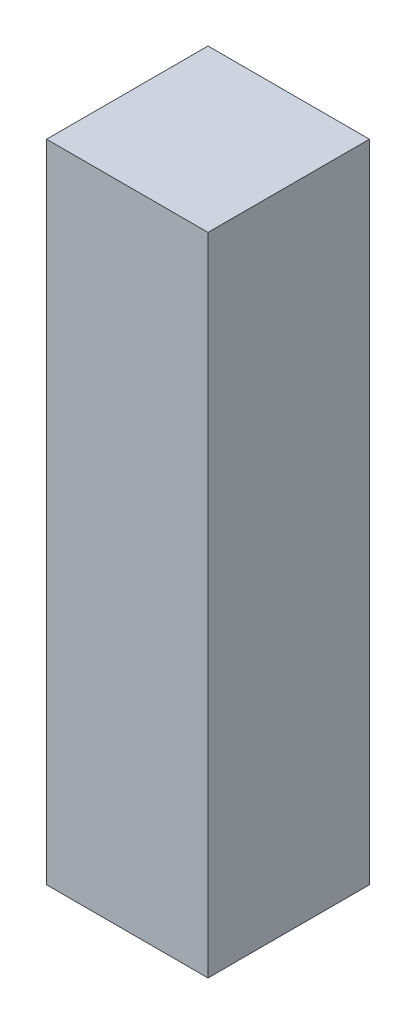
ISO-10303-21;
HEADER;
FILE_DESCRIPTION(('STEP AP214'),'2;1');
FILE_NAME('part.step','',(''),(''),'','','');
FILE_SCHEMA(('AUTOMOTIVE_DESIGN { 1 0 10303 214 1 1 1 1 }'));
ENDSEC;
DATA;
#1=APPLICATION_CONTEXT('core data for automotive mechanical design processes');
#2=APPLICATION_PROTOCOL_DEFINITION('international standard','automotive_design',2000,#1);
#3=PRODUCT_CONTEXT('',#1,'mechanical');
#4=PRODUCT('Part','Part','',(#3));
#5=PRODUCT_RELATED_PRODUCT_CATEGORY('part','',(#4));
#6=PRODUCT_DEFINITION_FORMATION('','',#4);
#7=PRODUCT_DEFINITION_CONTEXT('part definition',#1,'design');
#8=PRODUCT_DEFINITION('design','',#6,#7);
#9=PRODUCT_DEFINITION_SHAPE('','',#8);
#10=(LENGTH_UNIT() NAMED_UNIT(*) SI_UNIT(.MILLI.,.METRE.));
#11=(NAMED_UNIT(*) PLANE_ANGLE_UNIT() SI_UNIT($,.RADIAN.));
#12=(NAMED_UNIT(*) SI_UNIT($,.STERADIAN.) SOLID_ANGLE_UNIT());
#13=UNCERTAINTY_MEASURE_WITH_UNIT(LENGTH_MEASURE(1.E-05),#10,'distance_accuracy_value','');
#14=(GEOMETRIC_REPRESENTATION_CONTEXT(3) GLOBAL_UNCERTAINTY_ASSIGNED_CONTEXT((#13)) GLOBAL_UNIT_ASSIGNED_CONTEXT((#10,
#11,#12)) REPRESENTATION_CONTEXT('',''));
#15=CARTESIAN_POINT('',(0.,0.,0.));
#16=DIRECTION('',(0.,0.,1.));
#17=DIRECTION('',(1.,0.,0.));
#18=AXIS2_PLACEMENT_3D('',#15,#16,#17);
#19=CARTESIAN_POINT('',(2.5,20.,-2.5));
#20=DIRECTION('',(-1.,0.,0.));
#21=DIRECTION('',(0.,0.,1.));
#22=AXIS2_PLACEMENT_3D('',#19,#20,#21);
#23=PLANE('',#22);
#24=DIRECTION('',(0.,0.,-1.));
#25=VECTOR('',#24,1.);
#26=CARTESIAN_POINT('',(2.5,0.,-2.5));
#27=LINE('',#26,#25);
#28=CARTESIAN_POINT('',(2.5,0.,2.5));
#29=VERTEX_POINT('',#28);
#30=CARTESIAN_POINT('',(2.5,0.,-2.5));
#31=VERTEX_POINT('',#30);
#32=EDGE_CURVE('E97',#29,#31,#27,.T.);
#33=ORIENTED_EDGE('',*,*,#32,.T.);
#34=DIRECTION('',(0.,-1.,0.));
#35=VECTOR('',#34,1.);
#36=CARTESIAN_POINT('',(2.5,20.,-2.5));
#37=LINE('',#36,#35);
#38=CARTESIAN_POINT('',(2.5,20.,-2.5));
#39=VERTEX_POINT('',#38);
#40=EDGE_CURVE('E11',#39,#31,#37,.T.);
#41=ORIENTED_EDGE('',*,*,#40,.F.);
#42=DIRECTION('',(0.,0.,-1.));
#43=VECTOR('',#42,1.);
#44=CARTESIAN_POINT('',(2.5,20.,-2.5));
#45=LINE('',#44,#43);
#46=CARTESIAN_POINT('',(2.5,20.,2.5));
#47=VERTEX_POINT('',#46);
#48=EDGE_CURVE('E85',#47,#39,#45,.T.);
#49=ORIENTED_EDGE('',*,*,#48,.F.);
#50=DIRECTION('',(0.,-1.,0.));
#51=VECTOR('',#50,1.);
#52=CARTESIAN_POINT('',(2.5,20.,2.5));
#53=LINE('',#52,#51);
#54=EDGE_CURVE('E93',#47,#29,#53,.T.);
#55=ORIENTED_EDGE('',*,*,#54,.T.);
#56=EDGE_LOOP('',(#33,#41,#49,#55));
#57=FACE_BOUND('',#56,.T.);
#58=ADVANCED_FACE('F34',(#57),#23,.F.);
#59=CARTESIAN_POINT('',(-2.5,20.,-2.5));
#60=DIRECTION('',(0.,0.,1.));
#61=DIRECTION('',(1.,0.,0.));
#62=AXIS2_PLACEMENT_3D('',#59,#60,#61);
#63=PLANE('',#62);
#64=DIRECTION('',(-1.,0.,0.));
#65=VECTOR('',#64,1.);
#66=CARTESIAN_POINT('',(-2.5,0.,-2.5));
#67=LINE('',#66,#65);
#68=CARTESIAN_POINT('',(-2.5,0.,-2.5));
#69=VERTEX_POINT('',#68);
#70=EDGE_CURVE('E89',#31,#69,#67,.T.);
#71=ORIENTED_EDGE('',*,*,#70,.T.);
#72=DIRECTION('',(0.,-1.,0.));
#73=VECTOR('',#72,1.);
#74=CARTESIAN_POINT('',(-2.5,20.,-2.5));
#75=LINE('',#74,#73);
#76=CARTESIAN_POINT('',(-2.5,20.,-2.5));
#77=VERTEX_POINT('',#76);
#78=EDGE_CURVE('E42',#77,#69,#75,.T.);
#79=ORIENTED_EDGE('',*,*,#78,.F.);
#80=DIRECTION('',(-1.,0.,0.));
#81=VECTOR('',#80,1.);
#82=CARTESIAN_POINT('',(-2.5,20.,-2.5));
#83=LINE('',#82,#81);
#84=EDGE_CURVE('E80',#39,#77,#83,.T.);
#85=ORIENTED_EDGE('',*,*,#84,.F.);
#86=ORIENTED_EDGE('',*,*,#40,.T.);
#87=EDGE_LOOP('',(#71,#79,#85,#86));
#88=FACE_BOUND('',#87,.T.);
#89=ADVANCED_FACE('F88',(#88),#63,.F.);
#90=CARTESIAN_POINT('',(-2.5,20.,-2.5));
#91=DIRECTION('',(1.,0.,0.));
#92=DIRECTION('',(0.,0.,-1.));
#93=AXIS2_PLACEMENT_3D('',#90,#91,#92);
#94=PLANE('',#93);
#95=DIRECTION('',(0.,0.,1.));
#96=VECTOR('',#95,1.);
#97=CARTESIAN_POINT('',(-2.5,0.,-2.5));
#98=LINE('',#97,#96);
#99=CARTESIAN_POINT('',(-2.5,0.,2.5));
#100=VERTEX_POINT('',#99);
#101=EDGE_CURVE('E67',#69,#100,#98,.T.);
#102=ORIENTED_EDGE('',*,*,#101,.T.);
#103=DIRECTION('',(0.,-1.,0.));
#104=VECTOR('',#103,1.);
#105=CARTESIAN_POINT('',(-2.5,20.,2.5));
#106=LINE('',#105,#104);
#107=CARTESIAN_POINT('',(-2.5,20.,2.5));
#108=VERTEX_POINT('',#107);
#109=EDGE_CURVE('E90',#108,#100,#106,.T.);
#110=ORIENTED_EDGE('',*,*,#109,.F.);
#111=DIRECTION('',(0.,0.,1.));
#112=VECTOR('',#111,1.);
#113=CARTESIAN_POINT('',(-2.5,20.,-2.5));
#114=LINE('',#113,#112);
#115=EDGE_CURVE('E83',#77,#108,#114,.T.);
#116=ORIENTED_EDGE('',*,*,#115,.F.);
#117=ORIENTED_EDGE('',*,*,#78,.T.);
#118=EDGE_LOOP('',(#102,#110,#116,#117));
#119=FACE_BOUND('',#118,.T.);
#120=ADVANCED_FACE('F91',(#119),#94,.F.);
#121=CARTESIAN_POINT('',(-2.5,20.,2.5));
#122=DIRECTION('',(0.,0.,-1.));
#123=DIRECTION('',(-1.,0.,0.));
#124=AXIS2_PLACEMENT_3D('',#121,#122,#123);
#125=PLANE('',#124);
#126=DIRECTION('',(1.,0.,0.));
#127=VECTOR('',#126,1.);
#128=CARTESIAN_POINT('',(-2.5,0.,2.5));
#129=LINE('',#128,#127);
#130=EDGE_CURVE('E73',#100,#29,#129,.T.);
#131=ORIENTED_EDGE('',*,*,#130,.T.);
#132=ORIENTED_EDGE('',*,*,#54,.F.);
#133=DIRECTION('',(1.,0.,0.));
#134=VECTOR('',#133,1.);
#135=CARTESIAN_POINT('',(-2.5,20.,2.5));
#136=LINE('',#135,#134);
#137=EDGE_CURVE('E50',#108,#47,#136,.T.);
#138=ORIENTED_EDGE('',*,*,#137,.F.);
#139=ORIENTED_EDGE('',*,*,#109,.T.);
#140=EDGE_LOOP('',(#131,#132,#138,#139));
#141=FACE_BOUND('',#140,.T.);
#142=ADVANCED_FACE('F104',(#141),#125,.F.);
#143=CARTESIAN_POINT('',(0.,20.,0.));
#144=DIRECTION('',(0.,1.,0.));
#145=DIRECTION('',(0.,0.,1.));
#146=AXIS2_PLACEMENT_3D('',#143,#144,#145);
#147=PLANE('',#146);
#148=ORIENTED_EDGE('',*,*,#48,.T.);
#149=ORIENTED_EDGE('',*,*,#84,.T.);
#150=ORIENTED_EDGE('',*,*,#115,.T.);
#151=ORIENTED_EDGE('',*,*,#137,.T.);
#152=EDGE_LOOP('',(#148,#149,#150,#151));
#153=FACE_BOUND('',#152,.T.);
#154=ADVANCED_FACE('F81',(#153),#147,.T.);
#155=CARTESIAN_POINT('',(0.,0.,0.));
#156=DIRECTION('',(0.,1.,0.));
#157=DIRECTION('',(0.,0.,1.));
#158=AXIS2_PLACEMENT_3D('',#155,#156,#157);
#159=PLANE('',#158);
#160=ORIENTED_EDGE('',*,*,#32,.F.);
#161=ORIENTED_EDGE('',*,*,#130,.F.);
#162=ORIENTED_EDGE('',*,*,#101,.F.);
#163=ORIENTED_EDGE('',*,*,#70,.F.);
#164=EDGE_LOOP('',(#160,#161,#162,#163));
#165=FACE_BOUND('',#164,.T.);
#166=ADVANCED_FACE('F107',(#165),#159,.F.);
#167=CLOSED_SHELL('',(#58,#89,#120,#142,#154,#166));
#168=MANIFOLD_SOLID_BREP('B2',#167);
#169=ADVANCED_BREP_SHAPE_REPRESENTATION('',(#18,#168),#14);
#170=SHAPE_DEFINITION_REPRESENTATION(#9,#169);
ENDSEC;
END-ISO-10303-21;
